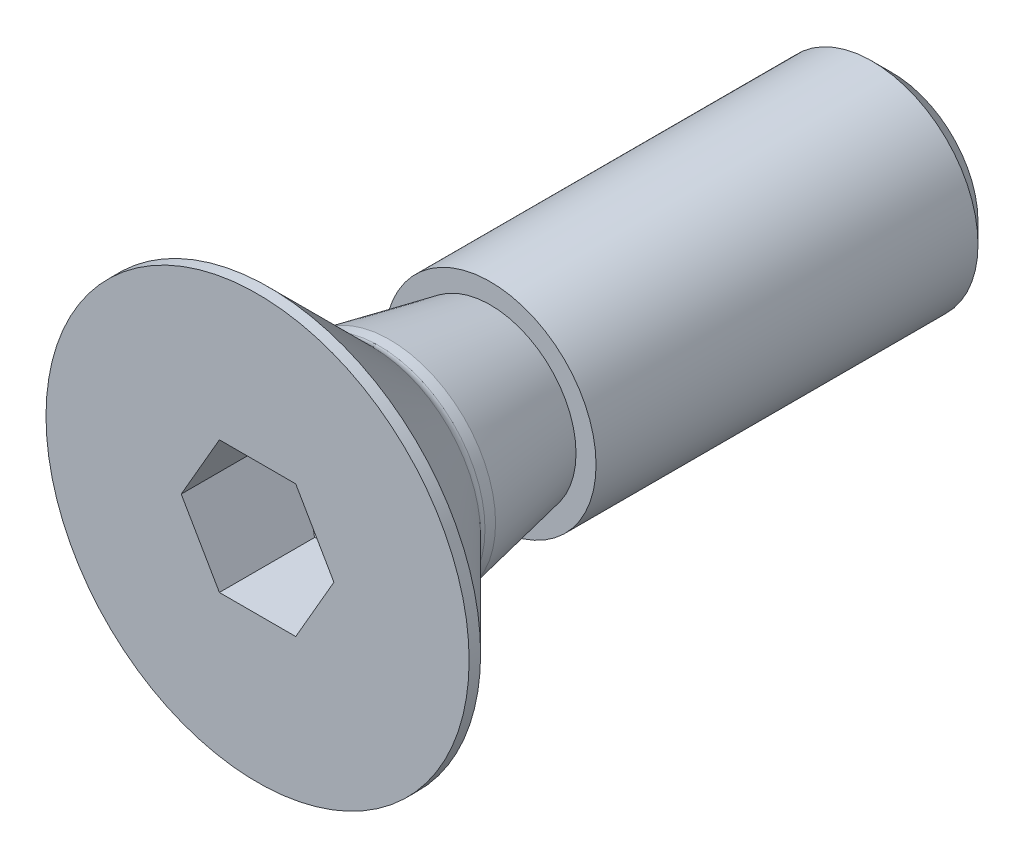
ISO-10303-21;
HEADER;
FILE_DESCRIPTION(('STEP AP214'),'2;1');
FILE_NAME('part.step','',(''),(''),'','','');
FILE_SCHEMA(('AUTOMOTIVE_DESIGN { 1 0 10303 214 1 1 1 1 }'));
ENDSEC;
DATA;
#1=APPLICATION_CONTEXT('core data for automotive mechanical design processes');
#2=APPLICATION_PROTOCOL_DEFINITION('international standard','automotive_design',2000,#1);
#3=PRODUCT_CONTEXT('',#1,'mechanical');
#4=PRODUCT('Part','Part','',(#3));
#5=PRODUCT_RELATED_PRODUCT_CATEGORY('part','',(#4));
#6=PRODUCT_DEFINITION_FORMATION('','',#4);
#7=PRODUCT_DEFINITION_CONTEXT('part definition',#1,'design');
#8=PRODUCT_DEFINITION('design','',#6,#7);
#9=PRODUCT_DEFINITION_SHAPE('','',#8);
#10=(LENGTH_UNIT() NAMED_UNIT(*) SI_UNIT(.MILLI.,.METRE.));
#11=(NAMED_UNIT(*) PLANE_ANGLE_UNIT() SI_UNIT($,.RADIAN.));
#12=(NAMED_UNIT(*) SI_UNIT($,.STERADIAN.) SOLID_ANGLE_UNIT());
#13=UNCERTAINTY_MEASURE_WITH_UNIT(LENGTH_MEASURE(1.E-05),#10,'distance_accuracy_value','');
#14=(GEOMETRIC_REPRESENTATION_CONTEXT(3) GLOBAL_UNCERTAINTY_ASSIGNED_CONTEXT((#13)) GLOBAL_UNIT_ASSIGNED_CONTEXT((#10,
#11,#12)) REPRESENTATION_CONTEXT('',''));
#15=CARTESIAN_POINT('',(0.,0.,0.));
#16=DIRECTION('',(0.,0.,1.));
#17=DIRECTION('',(1.,0.,0.));
#18=AXIS2_PLACEMENT_3D('',#15,#16,#17);
#19=CARTESIAN_POINT('',(0.,0.,0.));
#20=DIRECTION('',(0.,0.,1.));
#21=DIRECTION('',(1.,0.,0.));
#22=AXIS2_PLACEMENT_3D('',#19,#20,#21);
#23=CYLINDRICAL_SURFACE('',#22,2.);
#24=CARTESIAN_POINT('',(0.,0.,-2.3));
#25=DIRECTION('',(0.,0.,1.));
#26=DIRECTION('',(1.,0.,0.));
#27=AXIS2_PLACEMENT_3D('',#24,#25,#26);
#28=CIRCLE('',#27,2.);
#29=CARTESIAN_POINT('',(2.,0.,-2.3));
#30=VERTEX_POINT('',#29);
#31=EDGE_CURVE('E224',#30,#30,#28,.T.);
#32=ORIENTED_EDGE('',*,*,#31,.F.);
#33=EDGE_LOOP('',(#32));
#34=FACE_BOUND('',#33,.T.);
#35=CARTESIAN_POINT('',(0.,0.,-2.5));
#36=DIRECTION('',(0.,0.,1.));
#37=DIRECTION('',(1.,0.,0.));
#38=AXIS2_PLACEMENT_3D('',#35,#36,#37);
#39=CIRCLE('',#38,2.);
#40=CARTESIAN_POINT('',(2.,0.,-2.5));
#41=VERTEX_POINT('',#40);
#42=EDGE_CURVE('E152',#41,#41,#39,.T.);
#43=ORIENTED_EDGE('',*,*,#42,.T.);
#44=EDGE_LOOP('',(#43));
#45=FACE_BOUND('',#44,.T.);
#46=ADVANCED_FACE('F16',(#34,#45),#23,.T.);
#47=CARTESIAN_POINT('',(0.,4.,0.));
#48=DIRECTION('',(0.,0.,-1.));
#49=DIRECTION('',(-1.,0.,0.));
#50=AXIS2_PLACEMENT_3D('',#47,#48,#49);
#51=PLANE('',#50);
#52=CARTESIAN_POINT('',(0.,0.,0.));
#53=DIRECTION('',(0.,0.,1.));
#54=DIRECTION('',(1.,0.,0.));
#55=AXIS2_PLACEMENT_3D('',#52,#53,#54);
#56=CIRCLE('',#55,4.);
#57=CARTESIAN_POINT('',(4.,0.,0.));
#58=VERTEX_POINT('',#57);
#59=EDGE_CURVE('E206',#58,#58,#56,.T.);
#60=ORIENTED_EDGE('',*,*,#59,.T.);
#61=EDGE_LOOP('',(#60));
#62=FACE_BOUND('',#61,.T.);
#63=DIRECTION('',(0.5,-0.866025403784439,0.));
#64=VECTOR('',#63,1.);
#65=CARTESIAN_POINT('',(0.7216875,1.24999941718736,0.));
#66=LINE('',#65,#64);
#67=CARTESIAN_POINT('',(0.7216875,1.24999941718736,0.));
#68=VERTEX_POINT('',#67);
#69=CARTESIAN_POINT('',(1.443375,0.,0.));
#70=VERTEX_POINT('',#69);
#71=EDGE_CURVE('E94',#68,#70,#66,.T.);
#72=ORIENTED_EDGE('',*,*,#71,.T.);
#73=DIRECTION('',(-0.5,-0.866025403784439,0.));
#74=VECTOR('',#73,1.);
#75=CARTESIAN_POINT('',(1.443375,0.,0.));
#76=LINE('',#75,#74);
#77=CARTESIAN_POINT('',(0.7216875,-1.24999941718736,0.));
#78=VERTEX_POINT('',#77);
#79=EDGE_CURVE('E106',#70,#78,#76,.T.);
#80=ORIENTED_EDGE('',*,*,#79,.T.);
#81=DIRECTION('',(-1.,0.,0.));
#82=VECTOR('',#81,1.);
#83=CARTESIAN_POINT('',(0.7216875,-1.24999941718736,0.));
#84=LINE('',#83,#82);
#85=CARTESIAN_POINT('',(-0.7216875,-1.24999941718736,0.));
#86=VERTEX_POINT('',#85);
#87=EDGE_CURVE('E195',#78,#86,#84,.T.);
#88=ORIENTED_EDGE('',*,*,#87,.T.);
#89=DIRECTION('',(-0.5,0.866025403784439,0.));
#90=VECTOR('',#89,1.);
#91=CARTESIAN_POINT('',(-0.7216875,-1.24999941718736,0.));
#92=LINE('',#91,#90);
#93=CARTESIAN_POINT('',(-1.443375,0.,0.));
#94=VERTEX_POINT('',#93);
#95=EDGE_CURVE('E191',#86,#94,#92,.T.);
#96=ORIENTED_EDGE('',*,*,#95,.T.);
#97=DIRECTION('',(0.5,0.866025403784439,0.));
#98=VECTOR('',#97,1.);
#99=CARTESIAN_POINT('',(-1.443375,0.,0.));
#100=LINE('',#99,#98);
#101=CARTESIAN_POINT('',(-0.7216875,1.24999941718736,0.));
#102=VERTEX_POINT('',#101);
#103=EDGE_CURVE('E90',#94,#102,#100,.T.);
#104=ORIENTED_EDGE('',*,*,#103,.T.);
#105=DIRECTION('',(1.,0.,0.));
#106=VECTOR('',#105,1.);
#107=CARTESIAN_POINT('',(-0.7216875,1.24999941718736,0.));
#108=LINE('',#107,#106);
#109=EDGE_CURVE('E130',#102,#68,#108,.T.);
#110=ORIENTED_EDGE('',*,*,#109,.T.);
#111=EDGE_LOOP('',(#72,#80,#88,#96,#104,#110));
#112=FACE_BOUND('',#111,.T.);
#113=ADVANCED_FACE('F18',(#62,#112),#51,.F.);
#114=CARTESIAN_POINT('',(0.,0.,-2.3));
#115=DIRECTION('',(0.,0.,1.));
#116=DIRECTION('',(1.,0.,0.));
#117=AXIS2_PLACEMENT_3D('',#114,#115,#116);
#118=TOROIDAL_SURFACE('',#117,2.2,0.2);
#119=ORIENTED_EDGE('',*,*,#31,.T.);
#120=EDGE_LOOP('',(#119));
#121=FACE_BOUND('',#120,.T.);
#122=CARTESIAN_POINT('',(0.,0.,-2.15857864376269));
#123=DIRECTION('',(0.,0.,1.));
#124=DIRECTION('',(1.,0.,0.));
#125=AXIS2_PLACEMENT_3D('',#122,#123,#124);
#126=CIRCLE('',#125,2.05857864376269);
#127=CARTESIAN_POINT('',(2.05857864376269,0.,-2.15857864376269));
#128=VERTEX_POINT('',#127);
#129=EDGE_CURVE('E218',#128,#128,#126,.T.);
#130=ORIENTED_EDGE('',*,*,#129,.F.);
#131=EDGE_LOOP('',(#130));
#132=FACE_BOUND('',#131,.T.);
#133=ADVANCED_FACE('F257',(#121,#132),#118,.F.);
#134=CARTESIAN_POINT('',(0.,0.,-2.15857864376269));
#135=DIRECTION('',(0.,0.,1.));
#136=DIRECTION('',(1.,0.,0.));
#137=AXIS2_PLACEMENT_3D('',#134,#135,#136);
#138=CONICAL_SURFACE('',#137,2.05857864376269,0.785398163397448);
#139=CARTESIAN_POINT('',(0.,0.,-0.217157287525382));
#140=DIRECTION('',(0.,0.,1.));
#141=DIRECTION('',(1.,0.,0.));
#142=AXIS2_PLACEMENT_3D('',#139,#140,#141);
#143=CIRCLE('',#142,4.);
#144=CARTESIAN_POINT('',(4.,0.,-0.217157287525381));
#145=VERTEX_POINT('',#144);
#146=EDGE_CURVE('E211',#145,#145,#143,.T.);
#147=ORIENTED_EDGE('',*,*,#146,.F.);
#148=EDGE_LOOP('',(#147));
#149=FACE_BOUND('',#148,.T.);
#150=ORIENTED_EDGE('',*,*,#129,.T.);
#151=EDGE_LOOP('',(#150));
#152=FACE_BOUND('',#151,.T.);
#153=ADVANCED_FACE('F352',(#149,#152),#138,.T.);
#154=CARTESIAN_POINT('',(0.,0.,0.));
#155=DIRECTION('',(0.,0.,1.));
#156=DIRECTION('',(1.,0.,0.));
#157=AXIS2_PLACEMENT_3D('',#154,#155,#156);
#158=CYLINDRICAL_SURFACE('',#157,4.);
#159=ORIENTED_EDGE('',*,*,#59,.F.);
#160=EDGE_LOOP('',(#159));
#161=FACE_BOUND('',#160,.T.);
#162=ORIENTED_EDGE('',*,*,#146,.T.);
#163=EDGE_LOOP('',(#162));
#164=FACE_BOUND('',#163,.T.);
#165=ADVANCED_FACE('F182',(#161,#164),#158,.T.);
#166=CARTESIAN_POINT('',(0.7216875,1.24999941718736,-3.63333294479158));
#167=DIRECTION('',(-0.866025403784439,-0.5,0.));
#168=DIRECTION('',(-0.5,0.866025403784439,0.));
#169=AXIS2_PLACEMENT_3D('',#166,#167,#168);
#170=PLANE('',#169);
#171=DIRECTION('',(0.,0.,1.));
#172=VECTOR('',#171,1.);
#173=CARTESIAN_POINT('',(0.7216875,1.24999941718736,-3.63333294479158));
#174=LINE('',#173,#172);
#175=CARTESIAN_POINT('',(0.7216875,1.24999941718736,-1.8));
#176=VERTEX_POINT('',#175);
#177=EDGE_CURVE('E32',#176,#68,#174,.T.);
#178=ORIENTED_EDGE('',*,*,#177,.F.);
#179=CARTESIAN_POINT('',(1.44337615470054,-2.E-06,-1.79999933333254));
#180=CARTESIAN_POINT('',(1.41166234028678,0.0549279378664336,-1.81831466384599));
#181=CARTESIAN_POINT('',(1.37967477272109,0.110332030100754,-1.834971506758));
#182=CARTESIAN_POINT('',(1.31514579266581,0.222099502117096,-1.86404554497845));
#183=CARTESIAN_POINT('',(1.28260323398259,0.278464867164723,-1.87645245608369));
#184=CARTESIAN_POINT('',(1.2179214008177,0.39049708853301,-1.89576473395903));
#185=CARTESIAN_POINT('',(1.18579207575664,0.446146711951657,-1.90279864918316));
#186=CARTESIAN_POINT('',(1.12138232312734,0.557707676008561,-1.91119415112888));
#187=CARTESIAN_POINT('',(1.08910212951503,0.613618611423235,-1.9125626916718));
#188=CARTESIAN_POINT('',(1.02878989848834,0.718082459879303,-1.90970859848893));
#189=CARTESIAN_POINT('',(1.00074881136366,0.766651047478699,-1.90618673930223));
#190=CARTESIAN_POINT('',(0.94484931590916,0.863471813723365,-1.89502670475172));
#191=CARTESIAN_POINT('',(0.916991100780736,0.91172365773398,-1.88738472076412));
#192=CARTESIAN_POINT('',(0.860976444321451,1.00874388868998,-1.86828121424634));
#193=CARTESIAN_POINT('',(0.832827088932361,1.05750000242419,-1.85673874987155));
#194=CARTESIAN_POINT('',(0.776948107685497,1.15428523701895,-1.8305422256394));
#195=CARTESIAN_POINT('',(0.749217766489108,1.20231559688232,-1.81589431709011));
#196=CARTESIAN_POINT('',(0.721686345299461,1.25000141718736,-1.79999933333254));
#197=B_SPLINE_CURVE_WITH_KNOTS('',3,(#179,#180,#181,#182,#183,#184,#185,#186,#187,#188,#189,
#190,#191,#192,#193,#194,#195,#196),.UNSPECIFIED.,.F.,.F.,(4,2,2,2,2,2,2,2,4),(0.,
0.198135072963001,0.396746271230005,0.590442442133857,0.783900794935013,0.95231854699779,
1.12089225123217,1.29320414395206,1.46517785562982),.UNSPECIFIED.);
#198=CARTESIAN_POINT('',(1.443375,0.,-1.8));
#199=VERTEX_POINT('',#198);
#200=EDGE_CURVE('E81',#199,#176,#197,.T.);
#201=ORIENTED_EDGE('',*,*,#200,.F.);
#202=DIRECTION('',(0.,0.,1.));
#203=VECTOR('',#202,1.);
#204=CARTESIAN_POINT('',(1.443375,0.,-3.63333294479158));
#205=LINE('',#204,#203);
#206=EDGE_CURVE('E121',#199,#70,#205,.T.);
#207=ORIENTED_EDGE('',*,*,#206,.T.);
#208=ORIENTED_EDGE('',*,*,#71,.F.);
#209=EDGE_LOOP('',(#178,#201,#207,#208));
#210=FACE_BOUND('',#209,.T.);
#211=ADVANCED_FACE('F92',(#210),#170,.T.);
#212=CARTESIAN_POINT('',(1.443375,0.,-3.63333294479158));
#213=DIRECTION('',(-0.866025403784439,0.5,0.));
#214=DIRECTION('',(0.5,0.866025403784439,0.));
#215=AXIS2_PLACEMENT_3D('',#212,#213,#214);
#216=PLANE('',#215);
#217=ORIENTED_EDGE('',*,*,#206,.F.);
#218=CARTESIAN_POINT('',(0.721686345299462,-1.25000141718736,-1.79999933333254));
#219=CARTESIAN_POINT('',(0.753400159713217,-1.19507147932093,-1.81831466384599));
#220=CARTESIAN_POINT('',(0.785387727278908,-1.13966738708661,-1.834971506758));
#221=CARTESIAN_POINT('',(0.849916707334187,-1.02789991507027,-1.86404554497845));
#222=CARTESIAN_POINT('',(0.882459266017406,-0.971534550022641,-1.87645245608369));
#223=CARTESIAN_POINT('',(0.947141099182298,-0.859502328654354,-1.89576473395903));
#224=CARTESIAN_POINT('',(0.979270424243356,-0.803852705235707,-1.90279864918316));
#225=CARTESIAN_POINT('',(1.04368017687266,-0.692291741178803,-1.91119415112888));
#226=CARTESIAN_POINT('',(1.07596037048497,-0.63638080576413,-1.9125626916718));
#227=CARTESIAN_POINT('',(1.13627260151166,-0.531916957308062,-1.90970859848893));
#228=CARTESIAN_POINT('',(1.16431368863633,-0.483348369708666,-1.90618673930223));
#229=CARTESIAN_POINT('',(1.22021318409084,-0.386527603464,-1.89502670475172));
#230=CARTESIAN_POINT('',(1.24807139921926,-0.338275759453385,-1.88738472076412));
#231=CARTESIAN_POINT('',(1.30408605567855,-0.241255528497386,-1.86828121424634));
#232=CARTESIAN_POINT('',(1.33223541106764,-0.192499414763169,-1.85673874987155));
#233=CARTESIAN_POINT('',(1.3881143923145,-0.0957141801684129,-1.8305422256394));
#234=CARTESIAN_POINT('',(1.41584473351089,-0.0476838203050467,-1.81589431709011));
#235=CARTESIAN_POINT('',(1.44337615470054,1.99999999980412E-06,-1.79999933333254));
#236=B_SPLINE_CURVE_WITH_KNOTS('',3,(#218,#219,#220,#221,#222,#223,#224,#225,#226,#227,#228,
#229,#230,#231,#232,#233,#234,#235),.UNSPECIFIED.,.F.,.F.,(4,2,2,2,2,2,2,2,4),(0.,
0.198135072963,0.396746271230005,0.590442442133857,0.783900794935012,0.952318546997789,
1.12089225123217,1.29320414395206,1.46517785562982),.UNSPECIFIED.);
#237=CARTESIAN_POINT('',(0.7216875,-1.24999941718736,-1.8));
#238=VERTEX_POINT('',#237);
#239=EDGE_CURVE('E85',#238,#199,#236,.T.);
#240=ORIENTED_EDGE('',*,*,#239,.F.);
#241=DIRECTION('',(0.,0.,1.));
#242=VECTOR('',#241,1.);
#243=CARTESIAN_POINT('',(0.7216875,-1.24999941718736,-3.63333294479158));
#244=LINE('',#243,#242);
#245=EDGE_CURVE('E117',#238,#78,#244,.T.);
#246=ORIENTED_EDGE('',*,*,#245,.T.);
#247=ORIENTED_EDGE('',*,*,#79,.F.);
#248=EDGE_LOOP('',(#217,#240,#246,#247));
#249=FACE_BOUND('',#248,.T.);
#250=ADVANCED_FACE('F173',(#249),#216,.T.);
#251=CARTESIAN_POINT('',(0.7216875,-1.24999941718736,-3.63333294479158));
#252=DIRECTION('',(0.,1.,0.));
#253=DIRECTION('',(1.,0.,0.));
#254=AXIS2_PLACEMENT_3D('',#251,#252,#253);
#255=PLANE('',#254);
#256=ORIENTED_EDGE('',*,*,#245,.F.);
#257=CARTESIAN_POINT('',(-1.86893053107489,-1.24999941718736,-1.33520610546338));
#258=CARTESIAN_POINT('',(-1.81495117776836,-1.24999941718736,-1.36110336553914));
#259=CARTESIAN_POINT('',(-1.76084043441986,-1.24999941718736,-1.38673156982417));
#260=CARTESIAN_POINT('',(-1.65228585942289,-1.24999941718736,-1.43729740698206));
#261=CARTESIAN_POINT('',(-1.59784196995446,-1.24999941718736,-1.46223491557562));
#262=CARTESIAN_POINT('',(-1.48823862830604,-1.24999941718736,-1.51140621587152));
#263=CARTESIAN_POINT('',(-1.43307683885742,-1.24999941718736,-1.535634821182));
#264=CARTESIAN_POINT('',(-1.32229127521218,-1.24999941718736,-1.58300502760232));
#265=CARTESIAN_POINT('',(-1.26666752521415,-1.24999941718736,-1.60614668523167));
#266=CARTESIAN_POINT('',(-1.15340030068293,-1.24999941718736,-1.65164545298225));
#267=CARTESIAN_POINT('',(-1.09574203904477,-1.24999941718736,-1.67396624053161));
#268=CARTESIAN_POINT('',(-0.979740631963517,-1.24999941718736,-1.7167445598185));
#269=CARTESIAN_POINT('',(-0.921397401730978,-1.24999941718736,-1.73720185807762));
#270=CARTESIAN_POINT('',(-0.745435180245369,-1.24999941718736,-1.7949157638346));
#271=CARTESIAN_POINT('',(-0.626561647576072,-1.24999941718736,-1.8286497713202));
#272=CARTESIAN_POINT('',(-0.445872875814715,-1.24999941718736,-1.86777956156641));
#273=CARTESIAN_POINT('',(-0.385304520505474,-1.24999941718736,-1.87890590259941));
#274=CARTESIAN_POINT('',(-0.263486469039549,-1.24999941718736,-1.89657210272847));
#275=CARTESIAN_POINT('',(-0.20223681921018,-1.24999941718736,-1.90311227176594));
#276=CARTESIAN_POINT('',(-0.0801324091719259,-1.24999941718736,-1.91100116721612));
#277=CARTESIAN_POINT('',(-0.0192817104364654,-1.24999941718736,-1.91241115633369));
#278=CARTESIAN_POINT('',(0.102319185361569,-1.24999941718736,-1.91008376076964));
#279=CARTESIAN_POINT('',(0.163069375967905,-1.24999941718736,-1.90634605736359));
#280=CARTESIAN_POINT('',(0.312961455362286,-1.24999941718736,-1.89110192923387));
#281=CARTESIAN_POINT('',(0.40181287263432,-1.24999941718736,-1.87673871507949));
#282=CARTESIAN_POINT('',(0.577787885436386,-1.24999941718736,-1.83970013003255));
#283=CARTESIAN_POINT('',(0.664909264565296,-1.24999941718736,-1.8170147409968));
#284=CARTESIAN_POINT('',(0.795208864990652,-1.24999941718736,-1.77826255341911));
#285=CARTESIAN_POINT('',(0.839060620655932,-1.24999941718736,-1.76437706854983));
#286=CARTESIAN_POINT('',(0.926307663712635,-1.24999941718736,-1.73532161198726));
#287=CARTESIAN_POINT('',(0.969703217226752,-1.24999941718736,-1.72015244191295));
#288=CARTESIAN_POINT('',(1.05609584795378,-1.24999941718736,-1.68874991589815));
#289=CARTESIAN_POINT('',(1.09909299597128,-1.24999941718736,-1.67251675335748));
#290=CARTESIAN_POINT('',(1.18474848915208,-1.24999941718736,-1.63916183010982));
#291=CARTESIAN_POINT('',(1.22740677566046,-1.24999941718736,-1.62203991927052));
#292=CARTESIAN_POINT('',(1.33629337906013,-1.24999941718736,-1.57723891874489));
#293=CARTESIAN_POINT('',(1.40230397627437,-1.24999941718736,-1.54903123787647));
#294=CARTESIAN_POINT('',(1.53372907463052,-1.24999941718736,-1.49125610878032));
#295=CARTESIAN_POINT('',(1.59914353067598,-1.24999941718736,-1.46168855868856));
#296=CARTESIAN_POINT('',(1.79469131828896,-1.24999941718736,-1.37142547137653));
#297=CARTESIAN_POINT('',(1.92410722703437,-1.24999941718736,-1.30917875067825));
#298=CARTESIAN_POINT('',(2.18183340208154,-1.24999941718736,-1.18207469272276));
#299=CARTESIAN_POINT('',(2.31014211360569,-1.24999941718736,-1.1172142402301));
#300=CARTESIAN_POINT('',(2.565880437641,-1.24999941718736,-0.985825560455861));
#301=CARTESIAN_POINT('',(2.69331015929244,-1.24999941718736,-0.919297545160822));
#302=CARTESIAN_POINT('',(2.93556233058972,-1.24999941718736,-0.791426204179085));
#303=CARTESIAN_POINT('',(3.05043950275985,-1.24999941718736,-0.730186190566507));
#304=CARTESIAN_POINT('',(3.27982431975771,-1.24999941718736,-0.607008392995773));
#305=CARTESIAN_POINT('',(3.39433195070739,-1.24999941718736,-0.545070583215424));
#306=CARTESIAN_POINT('',(3.62277162051502,-1.24999941718736,-0.420830385501942));
#307=CARTESIAN_POINT('',(3.73670438259663,-1.24999941718736,-0.35852932557922));
#308=CARTESIAN_POINT('',(3.96433956104115,-1.24999941718736,-0.23352171391467));
#309=CARTESIAN_POINT('',(4.07804198914646,-1.24999941718736,-0.170815183563577));
#310=CARTESIAN_POINT('',(4.19166166337244,-1.24999941718736,-0.107959966189874));
#311=B_SPLINE_CURVE_WITH_KNOTS('',3,(#257,#258,#259,#260,#261,#262,#263,#264,#265,#266,#267,
#268,#269,#270,#271,#272,#273,#274,#275,#276,#277,#278,#279,#280,#281,#282,#283,#284,#285,#286,
#287,#288,#289,#290,#291,#292,#293,#294,#295,#296,#297,#298,#299,#300,#301,#302,#303,#304,#305,
#306,#307,#308,#309,#310),.UNSPECIFIED.,.F.,.F.,(4,2,2,2,2,2,2,2,2,2,2,2,2,2,2,2,2,2,2,2,2,2,2,
2,2,2,4),(0.,0.179612840817484,0.359257792773137,0.539992477393522,0.720717753677289,
0.906167353114827,1.09164015584897,1.46153946542598,1.64614477745769,1.83073761234132,
2.01311873652213,2.1955111535168,2.46497183475509,2.73475795996105,2.87273569413165,
3.01062789275234,3.14849509611698,3.28638566505407,3.50171816734966,3.71706682595868,
4.14783526963883,4.57913326931211,5.01037671616215,5.40091711572386,5.79147201515411,
6.18103353481212,6.57057466801426),.UNSPECIFIED.);
#312=CARTESIAN_POINT('',(-0.7216875,-1.24999941718736,-1.8));
#313=VERTEX_POINT('',#312);
#314=EDGE_CURVE('E160',#313,#238,#311,.T.);
#315=ORIENTED_EDGE('',*,*,#314,.F.);
#316=DIRECTION('',(0.,0.,1.));
#317=VECTOR('',#316,1.);
#318=CARTESIAN_POINT('',(-0.7216875,-1.24999941718736,-3.63333294479158));
#319=LINE('',#318,#317);
#320=EDGE_CURVE('E113',#313,#86,#319,.T.);
#321=ORIENTED_EDGE('',*,*,#320,.T.);
#322=ORIENTED_EDGE('',*,*,#87,.F.);
#323=EDGE_LOOP('',(#256,#315,#321,#322));
#324=FACE_BOUND('',#323,.T.);
#325=ADVANCED_FACE('F170',(#324),#255,.T.);
#326=CARTESIAN_POINT('',(-0.7216875,-1.24999941718736,-3.63333294479158));
#327=DIRECTION('',(0.866025403784439,0.5,0.));
#328=DIRECTION('',(0.5,-0.866025403784439,0.));
#329=AXIS2_PLACEMENT_3D('',#326,#327,#328);
#330=PLANE('',#329);
#331=ORIENTED_EDGE('',*,*,#320,.F.);
#332=CARTESIAN_POINT('',(-1.44337615470054,2.00000000041633E-06,-1.79999933333254));
#333=CARTESIAN_POINT('',(-1.41166234028678,-0.0549279378664329,-1.81831466384599));
#334=CARTESIAN_POINT('',(-1.37967477272109,-0.110332030100753,-1.834971506758));
#335=CARTESIAN_POINT('',(-1.31514579266581,-0.222099502117095,-1.86404554497845));
#336=CARTESIAN_POINT('',(-1.28260323398259,-0.278464867164723,-1.87645245608369));
#337=CARTESIAN_POINT('',(-1.2179214008177,-0.390497088533009,-1.89576473395903));
#338=CARTESIAN_POINT('',(-1.18579207575664,-0.446146711951657,-1.90279864918316));
#339=CARTESIAN_POINT('',(-1.12138232312734,-0.557707676008561,-1.91119415112888));
#340=CARTESIAN_POINT('',(-1.08910212951503,-0.613618611423234,-1.9125626916718));
#341=CARTESIAN_POINT('',(-1.02878989848834,-0.718082459879302,-1.90970859848893));
#342=CARTESIAN_POINT('',(-1.00074881136366,-0.766651047478698,-1.90618673930223));
#343=CARTESIAN_POINT('',(-0.944849315909161,-0.863471813723365,-1.89502670475172));
#344=CARTESIAN_POINT('',(-0.916991100780737,-0.911723657733979,-1.88738472076412));
#345=CARTESIAN_POINT('',(-0.860976444321451,-1.00874388868998,-1.86828121424634));
#346=CARTESIAN_POINT('',(-0.832827088932361,-1.05750000242419,-1.85673874987155));
#347=CARTESIAN_POINT('',(-0.776948107685497,-1.15428523701895,-1.8305422256394));
#348=CARTESIAN_POINT('',(-0.749217766489108,-1.20231559688232,-1.81589431709011));
#349=CARTESIAN_POINT('',(-0.721686345299461,-1.25000141718736,-1.79999933333254));
#350=B_SPLINE_CURVE_WITH_KNOTS('',3,(#332,#333,#334,#335,#336,#337,#338,#339,#340,#341,#342,
#343,#344,#345,#346,#347,#348,#349),.UNSPECIFIED.,.F.,.F.,(4,2,2,2,2,2,2,2,4),(0.,
0.198135072963001,0.396746271230005,0.590442442133857,0.783900794935013,0.952318546997791,
1.12089225123217,1.29320414395206,1.46517785562982),.UNSPECIFIED.);
#351=CARTESIAN_POINT('',(-1.443375,0.,-1.8));
#352=VERTEX_POINT('',#351);
#353=EDGE_CURVE('E151',#352,#313,#350,.T.);
#354=ORIENTED_EDGE('',*,*,#353,.F.);
#355=DIRECTION('',(0.,0.,1.));
#356=VECTOR('',#355,1.);
#357=CARTESIAN_POINT('',(-1.443375,0.,-3.63333294479158));
#358=LINE('',#357,#356);
#359=EDGE_CURVE('E103',#352,#94,#358,.T.);
#360=ORIENTED_EDGE('',*,*,#359,.T.);
#361=ORIENTED_EDGE('',*,*,#95,.F.);
#362=EDGE_LOOP('',(#331,#354,#360,#361));
#363=FACE_BOUND('',#362,.T.);
#364=ADVANCED_FACE('F141',(#363),#330,.T.);
#365=CARTESIAN_POINT('',(-1.443375,0.,-3.63333294479158));
#366=DIRECTION('',(0.866025403784439,-0.5,0.));
#367=DIRECTION('',(-0.5,-0.866025403784439,0.));
#368=AXIS2_PLACEMENT_3D('',#365,#366,#367);
#369=PLANE('',#368);
#370=ORIENTED_EDGE('',*,*,#359,.F.);
#371=CARTESIAN_POINT('',(-0.721686345299462,1.25000141718736,-1.79999933333254));
#372=CARTESIAN_POINT('',(-0.753400159713217,1.19507147932093,-1.81831466384599));
#373=CARTESIAN_POINT('',(-0.785387727278908,1.13966738708661,-1.834971506758));
#374=CARTESIAN_POINT('',(-0.849916707334187,1.02789991507027,-1.86404554497845));
#375=CARTESIAN_POINT('',(-0.882459266017407,0.971534550022641,-1.87645245608369));
#376=CARTESIAN_POINT('',(-0.947141099182299,0.859502328654354,-1.89576473395903));
#377=CARTESIAN_POINT('',(-0.979270424243356,0.803852705235707,-1.90279864918316));
#378=CARTESIAN_POINT('',(-1.04368017687266,0.692291741178803,-1.91119415112888));
#379=CARTESIAN_POINT('',(-1.07596037048497,0.636380805764129,-1.9125626916718));
#380=CARTESIAN_POINT('',(-1.13627260151166,0.531916957308061,-1.90970859848893));
#381=CARTESIAN_POINT('',(-1.16431368863634,0.483348369708665,-1.90618673930223));
#382=CARTESIAN_POINT('',(-1.22021318409084,0.386527603463999,-1.89502670475172));
#383=CARTESIAN_POINT('',(-1.24807139921926,0.338275759453385,-1.88738472076412));
#384=CARTESIAN_POINT('',(-1.30408605567855,0.241255528497386,-1.86828121424634));
#385=CARTESIAN_POINT('',(-1.33223541106764,0.192499414763169,-1.85673874987155));
#386=CARTESIAN_POINT('',(-1.3881143923145,0.0957141801684131,-1.8305422256394));
#387=CARTESIAN_POINT('',(-1.41584473351089,0.0476838203050469,-1.81589431709011));
#388=CARTESIAN_POINT('',(-1.44337615470054,-1.99999999947578E-06,-1.79999933333254));
#389=B_SPLINE_CURVE_WITH_KNOTS('',3,(#371,#372,#373,#374,#375,#376,#377,#378,#379,#380,#381,
#382,#383,#384,#385,#386,#387,#388),.UNSPECIFIED.,.F.,.F.,(4,2,2,2,2,2,2,2,4),(0.,
0.198135072963001,0.396746271230005,0.590442442133857,0.783900794935013,0.95231854699779,
1.12089225123217,1.29320414395206,1.46517785562982),.UNSPECIFIED.);
#390=CARTESIAN_POINT('',(-0.7216875,1.24999941718736,-1.8));
#391=VERTEX_POINT('',#390);
#392=EDGE_CURVE('E40',#391,#352,#389,.T.);
#393=ORIENTED_EDGE('',*,*,#392,.F.);
#394=DIRECTION('',(0.,0.,1.));
#395=VECTOR('',#394,1.);
#396=CARTESIAN_POINT('',(-0.7216875,1.24999941718736,-3.63333294479158));
#397=LINE('',#396,#395);
#398=EDGE_CURVE('E97',#391,#102,#397,.T.);
#399=ORIENTED_EDGE('',*,*,#398,.T.);
#400=ORIENTED_EDGE('',*,*,#103,.F.);
#401=EDGE_LOOP('',(#370,#393,#399,#400));
#402=FACE_BOUND('',#401,.T.);
#403=ADVANCED_FACE('F137',(#402),#369,.T.);
#404=CARTESIAN_POINT('',(-0.7216875,1.24999941718736,-3.63333294479158));
#405=DIRECTION('',(0.,-1.,0.));
#406=DIRECTION('',(-1.,0.,0.));
#407=AXIS2_PLACEMENT_3D('',#404,#405,#406);
#408=PLANE('',#407);
#409=ORIENTED_EDGE('',*,*,#398,.F.);
#410=CARTESIAN_POINT('',(-1.86893053107489,1.24999941718736,-1.33520610546338));
#411=CARTESIAN_POINT('',(-1.81495117776836,1.24999941718736,-1.36110336553914));
#412=CARTESIAN_POINT('',(-1.76084043441986,1.24999941718736,-1.38673156982417));
#413=CARTESIAN_POINT('',(-1.65228585942289,1.24999941718736,-1.43729740698206));
#414=CARTESIAN_POINT('',(-1.59784196995446,1.24999941718736,-1.46223491557562));
#415=CARTESIAN_POINT('',(-1.48823862830604,1.24999941718736,-1.51140621587152));
#416=CARTESIAN_POINT('',(-1.43307683885742,1.24999941718736,-1.535634821182));
#417=CARTESIAN_POINT('',(-1.32229127521218,1.24999941718736,-1.58300502760232));
#418=CARTESIAN_POINT('',(-1.26666752521415,1.24999941718736,-1.60614668523167));
#419=CARTESIAN_POINT('',(-1.15340030068293,1.24999941718736,-1.65164545298225));
#420=CARTESIAN_POINT('',(-1.09574203904477,1.24999941718736,-1.67396624053161));
#421=CARTESIAN_POINT('',(-0.979740631963518,1.24999941718736,-1.7167445598185));
#422=CARTESIAN_POINT('',(-0.921397401730978,1.24999941718736,-1.73720185807762));
#423=CARTESIAN_POINT('',(-0.745435180245369,1.24999941718736,-1.7949157638346));
#424=CARTESIAN_POINT('',(-0.626561647576073,1.24999941718736,-1.8286497713202));
#425=CARTESIAN_POINT('',(-0.445872875814716,1.24999941718736,-1.86777956156641));
#426=CARTESIAN_POINT('',(-0.385304520505475,1.24999941718736,-1.87890590259941));
#427=CARTESIAN_POINT('',(-0.26348646903955,1.24999941718736,-1.89657210272847));
#428=CARTESIAN_POINT('',(-0.202236819210181,1.24999941718736,-1.90311227176594));
#429=CARTESIAN_POINT('',(-0.0801324091719268,1.24999941718736,-1.91100116721612));
#430=CARTESIAN_POINT('',(-0.0192817104364662,1.24999941718736,-1.91241115633369));
#431=CARTESIAN_POINT('',(0.102319185361568,1.24999941718736,-1.91008376076964));
#432=CARTESIAN_POINT('',(0.163069375967905,1.24999941718736,-1.90634605736359));
#433=CARTESIAN_POINT('',(0.312961455362285,1.24999941718736,-1.89110192923387));
#434=CARTESIAN_POINT('',(0.401812872634319,1.24999941718736,-1.87673871507949));
#435=CARTESIAN_POINT('',(0.577787885436385,1.24999941718736,-1.83970013003254));
#436=CARTESIAN_POINT('',(0.664909264565294,1.24999941718736,-1.8170147409968));
#437=CARTESIAN_POINT('',(0.795208864990651,1.24999941718736,-1.77826255341911));
#438=CARTESIAN_POINT('',(0.839060620655931,1.24999941718736,-1.76437706854983));
#439=CARTESIAN_POINT('',(0.926307663712634,1.24999941718736,-1.73532161198726));
#440=CARTESIAN_POINT('',(0.96970321722675,1.24999941718736,-1.72015244191295));
#441=CARTESIAN_POINT('',(1.05609584795378,1.24999941718737,-1.68874991589815));
#442=CARTESIAN_POINT('',(1.09909299597128,1.24999941718737,-1.67251675335748));
#443=CARTESIAN_POINT('',(1.18474848915208,1.24999941718736,-1.63916183010982));
#444=CARTESIAN_POINT('',(1.22740677566045,1.24999941718736,-1.62203991927052));
#445=CARTESIAN_POINT('',(1.33629337906013,1.24999941718736,-1.57723891874489));
#446=CARTESIAN_POINT('',(1.40230397627436,1.24999941718736,-1.54903123787647));
#447=CARTESIAN_POINT('',(1.53372907463051,1.24999941718737,-1.49125610878032));
#448=CARTESIAN_POINT('',(1.59914353067597,1.24999941718737,-1.46168855868857));
#449=CARTESIAN_POINT('',(1.79469131828895,1.24999941718736,-1.37142547137654));
#450=CARTESIAN_POINT('',(1.92410722703437,1.24999941718737,-1.30917875067825));
#451=CARTESIAN_POINT('',(2.18183340208154,1.24999941718737,-1.18207469272276));
#452=CARTESIAN_POINT('',(2.31014211360569,1.24999941718737,-1.1172142402301));
#453=CARTESIAN_POINT('',(2.565880437641,1.24999941718737,-0.985825560455863));
#454=CARTESIAN_POINT('',(2.69331015929244,1.24999941718737,-0.919297545160824));
#455=CARTESIAN_POINT('',(2.93556233058972,1.24999941718737,-0.791426204179087));
#456=CARTESIAN_POINT('',(3.05043950275985,1.24999941718737,-0.730186190566508));
#457=CARTESIAN_POINT('',(3.27982431975771,1.24999941718737,-0.607008392995774));
#458=CARTESIAN_POINT('',(3.39433195070738,1.24999941718737,-0.545070583215425));
#459=CARTESIAN_POINT('',(3.62277162051502,1.24999941718737,-0.420830385501943));
#460=CARTESIAN_POINT('',(3.73670438259662,1.24999941718737,-0.358529325579222));
#461=CARTESIAN_POINT('',(3.96433956104115,1.24999941718737,-0.233521713914671));
#462=CARTESIAN_POINT('',(4.07804198914646,1.24999941718737,-0.170815183563578));
#463=CARTESIAN_POINT('',(4.19166166337243,1.24999941718737,-0.107959966189874));
#464=B_SPLINE_CURVE_WITH_KNOTS('',3,(#410,#411,#412,#413,#414,#415,#416,#417,#418,#419,#420,
#421,#422,#423,#424,#425,#426,#427,#428,#429,#430,#431,#432,#433,#434,#435,#436,#437,#438,#439,
#440,#441,#442,#443,#444,#445,#446,#447,#448,#449,#450,#451,#452,#453,#454,#455,#456,#457,#458,
#459,#460,#461,#462,#463),.UNSPECIFIED.,.F.,.F.,(4,2,2,2,2,2,2,2,2,2,2,2,2,2,2,2,2,2,2,2,2,2,2,
2,2,2,4),(0.,0.179612840817484,0.359257792773137,0.539992477393522,0.720717753677289,
0.906167353114827,1.09164015584897,1.46153946542598,1.64614477745769,1.83073761234132,
2.01311873652213,2.1955111535168,2.46497183475509,2.73475795996105,2.87273569413165,
3.01062789275234,3.14849509611698,3.28638566505407,3.50171816734966,3.71706682595868,
4.14783526963882,4.5791332693121,5.01037671616214,5.40091711572385,5.7914720151541,
6.18103353481212,6.57057466801426),.UNSPECIFIED.);
#465=EDGE_CURVE('E82',#176,#391,#464,.F.);
#466=ORIENTED_EDGE('',*,*,#465,.F.);
#467=ORIENTED_EDGE('',*,*,#177,.T.);
#468=ORIENTED_EDGE('',*,*,#109,.F.);
#469=EDGE_LOOP('',(#409,#466,#467,#468));
#470=FACE_BOUND('',#469,.T.);
#471=ADVANCED_FACE('F77',(#470),#408,.T.);
#472=CARTESIAN_POINT('',(0.,0.,-2.63333294479158));
#473=DIRECTION('',(0.,0.,1.));
#474=DIRECTION('',(1.,0.,0.));
#475=AXIS2_PLACEMENT_3D('',#472,#473,#474);
#476=CONICAL_SURFACE('',#475,0.,1.0471975511966);
#477=CARTESIAN_POINT('',(0.,0.,-2.63333294479158));
#478=VERTEX_POINT('',#477);
#479=VERTEX_LOOP('',#478);
#480=FACE_BOUND('',#479,.T.);
#481=ORIENTED_EDGE('',*,*,#200,.T.);
#482=ORIENTED_EDGE('',*,*,#465,.T.);
#483=ORIENTED_EDGE('',*,*,#392,.T.);
#484=ORIENTED_EDGE('',*,*,#353,.T.);
#485=ORIENTED_EDGE('',*,*,#314,.T.);
#486=ORIENTED_EDGE('',*,*,#239,.T.);
#487=EDGE_LOOP('',(#481,#482,#483,#484,#485,#486));
#488=FACE_BOUND('',#487,.T.);
#489=ADVANCED_FACE('F73',(#480,#488),#476,.F.);
#490=CARTESIAN_POINT('',(0.,0.,-2.5));
#491=DIRECTION('',(0.,0.,1.));
#492=DIRECTION('',(1.,0.,0.));
#493=AXIS2_PLACEMENT_3D('',#490,#491,#492);
#494=CONICAL_SURFACE('',#493,2.,0.196826163092446);
#495=CARTESIAN_POINT('',(0.,0.,-4.4));
#496=DIRECTION('',(0.,0.,1.));
#497=DIRECTION('',(1.,0.,0.));
#498=AXIS2_PLACEMENT_3D('',#495,#496,#497);
#499=CIRCLE('',#498,1.621125);
#500=CARTESIAN_POINT('',(1.621125,0.,-4.4));
#501=VERTEX_POINT('',#500);
#502=EDGE_CURVE('E396',#501,#501,#499,.T.);
#503=ORIENTED_EDGE('',*,*,#502,.T.);
#504=EDGE_LOOP('',(#503));
#505=FACE_BOUND('',#504,.T.);
#506=ORIENTED_EDGE('',*,*,#42,.F.);
#507=EDGE_LOOP('',(#506));
#508=FACE_BOUND('',#507,.T.);
#509=ADVANCED_FACE('F76',(#505,#508),#494,.T.);
#510=CARTESIAN_POINT('',(0.,1.621125,-4.4));
#511=DIRECTION('',(0.,0.,1.));
#512=DIRECTION('',(1.,0.,0.));
#513=AXIS2_PLACEMENT_3D('',#510,#511,#512);
#514=PLANE('',#513);
#515=CARTESIAN_POINT('',(0.,0.,-4.4));
#516=DIRECTION('',(0.,0.,1.));
#517=DIRECTION('',(1.,0.,0.));
#518=AXIS2_PLACEMENT_3D('',#515,#516,#517);
#519=CIRCLE('',#518,2.);
#520=CARTESIAN_POINT('',(2.,0.,-4.4));
#521=VERTEX_POINT('',#520);
#522=EDGE_CURVE('E401',#521,#521,#519,.T.);
#523=ORIENTED_EDGE('',*,*,#522,.T.);
#524=EDGE_LOOP('',(#523));
#525=FACE_BOUND('',#524,.T.);
#526=ORIENTED_EDGE('',*,*,#502,.F.);
#527=EDGE_LOOP('',(#526));
#528=FACE_BOUND('',#527,.T.);
#529=ADVANCED_FACE('F244',(#525,#528),#514,.T.);
#530=CARTESIAN_POINT('',(0.,0.,-12.));
#531=DIRECTION('',(0.,0.,1.));
#532=DIRECTION('',(1.,0.,0.));
#533=AXIS2_PLACEMENT_3D('',#530,#531,#532);
#534=PLANE('',#533);
#535=CARTESIAN_POINT('',(0.,0.,-12.));
#536=DIRECTION('',(0.,0.,1.));
#537=DIRECTION('',(1.,0.,0.));
#538=AXIS2_PLACEMENT_3D('',#535,#536,#537);
#539=CIRCLE('',#538,1.621125);
#540=CARTESIAN_POINT('',(1.621125,0.,-12.));
#541=VERTEX_POINT('',#540);
#542=EDGE_CURVE('E11',#541,#541,#539,.T.);
#543=ORIENTED_EDGE('',*,*,#542,.F.);
#544=EDGE_LOOP('',(#543));
#545=FACE_BOUND('',#544,.T.);
#546=ADVANCED_FACE('F239',(#545),#534,.F.);
#547=CARTESIAN_POINT('',(0.,0.,-12.));
#548=DIRECTION('',(0.,0.,1.));
#549=DIRECTION('',(1.,0.,0.));
#550=AXIS2_PLACEMENT_3D('',#547,#548,#549);
#551=CONICAL_SURFACE('',#550,1.621125,0.785398163397445);
#552=CARTESIAN_POINT('',(0.,0.,-11.621125));
#553=DIRECTION('',(0.,0.,1.));
#554=DIRECTION('',(1.,0.,0.));
#555=AXIS2_PLACEMENT_3D('',#552,#553,#554);
#556=CIRCLE('',#555,2.);
#557=CARTESIAN_POINT('',(2.,0.,-11.621125));
#558=VERTEX_POINT('',#557);
#559=EDGE_CURVE('E25',#558,#558,#556,.T.);
#560=ORIENTED_EDGE('',*,*,#559,.F.);
#561=EDGE_LOOP('',(#560));
#562=FACE_BOUND('',#561,.T.);
#563=ORIENTED_EDGE('',*,*,#542,.T.);
#564=EDGE_LOOP('',(#563));
#565=FACE_BOUND('',#564,.T.);
#566=ADVANCED_FACE('F236',(#562,#565),#551,.T.);
#567=ORIENTED_EDGE('',*,*,#559,.T.);
#568=EDGE_LOOP('',(#567));
#569=FACE_BOUND('',#568,.T.);
#570=ORIENTED_EDGE('',*,*,#522,.F.);
#571=EDGE_LOOP('',(#570));
#572=FACE_BOUND('',#571,.T.);
#573=ADVANCED_FACE('F233',(#569,#572),#23,.T.);
#574=CLOSED_SHELL('',(#46,#113,#133,#153,#165,#211,#250,#325,#364,#403,#471,#489,#509,#529,#546,
#566,#573));
#575=MANIFOLD_SOLID_BREP('B1',#574);
#576=ADVANCED_BREP_SHAPE_REPRESENTATION('',(#18,#575),#14);
#577=SHAPE_DEFINITION_REPRESENTATION(#9,#576);
ENDSEC;
END-ISO-10303-21;
